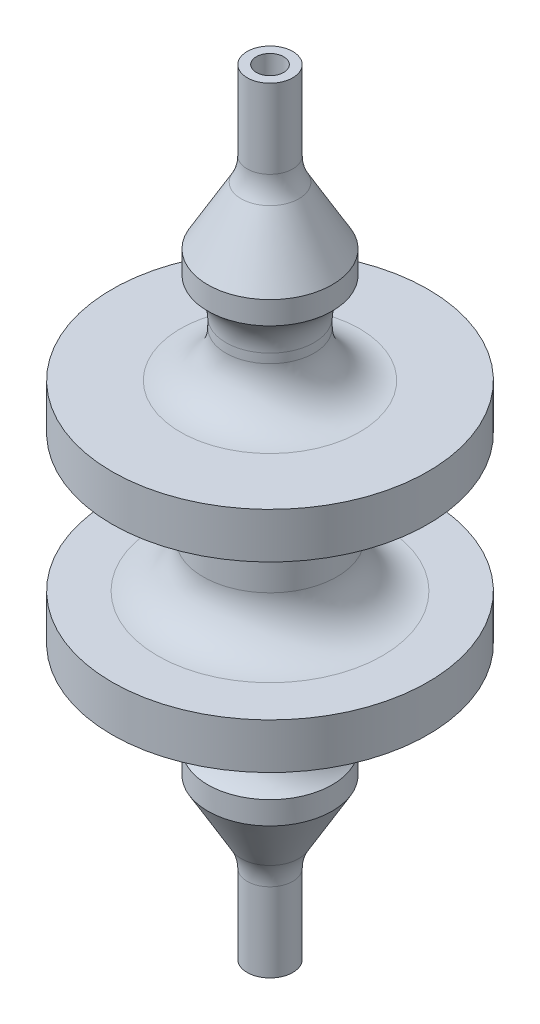
ISO-10303-21;
HEADER;
FILE_DESCRIPTION(('STEP AP214'),'2;1');
FILE_NAME('part.step','',(''),(''),'','','');
FILE_SCHEMA(('AUTOMOTIVE_DESIGN { 1 0 10303 214 1 1 1 1 }'));
ENDSEC;
DATA;
#1=APPLICATION_CONTEXT('core data for automotive mechanical design processes');
#2=APPLICATION_PROTOCOL_DEFINITION('international standard','automotive_design',2000,#1);
#3=PRODUCT_CONTEXT('',#1,'mechanical');
#4=PRODUCT('Part','Part','',(#3));
#5=PRODUCT_RELATED_PRODUCT_CATEGORY('part','',(#4));
#6=PRODUCT_DEFINITION_FORMATION('','',#4);
#7=PRODUCT_DEFINITION_CONTEXT('part definition',#1,'design');
#8=PRODUCT_DEFINITION('design','',#6,#7);
#9=PRODUCT_DEFINITION_SHAPE('','',#8);
#10=(LENGTH_UNIT() NAMED_UNIT(*) SI_UNIT(.MILLI.,.METRE.));
#11=(NAMED_UNIT(*) PLANE_ANGLE_UNIT() SI_UNIT($,.RADIAN.));
#12=(NAMED_UNIT(*) SI_UNIT($,.STERADIAN.) SOLID_ANGLE_UNIT());
#13=UNCERTAINTY_MEASURE_WITH_UNIT(LENGTH_MEASURE(1.E-05),#10,'distance_accuracy_value','');
#14=(GEOMETRIC_REPRESENTATION_CONTEXT(3) GLOBAL_UNCERTAINTY_ASSIGNED_CONTEXT((#13)) GLOBAL_UNIT_ASSIGNED_CONTEXT((#10,
#11,#12)) REPRESENTATION_CONTEXT('',''));
#15=CARTESIAN_POINT('',(0.,0.,0.));
#16=DIRECTION('',(0.,0.,1.));
#17=DIRECTION('',(1.,0.,0.));
#18=AXIS2_PLACEMENT_3D('',#15,#16,#17);
#19=CARTESIAN_POINT('',(-3.38399224030296,-8.66807827173179,0.));
#20=DIRECTION('',(0.,-1.,0.));
#21=DIRECTION('',(0.,0.,-1.));
#22=AXIS2_PLACEMENT_3D('',#19,#20,#21);
#23=PLANE('',#22);
#24=CARTESIAN_POINT('',(0.0820331634814877,-8.66807827173179,0.));
#25=DIRECTION('',(0.,-1.,0.));
#26=DIRECTION('',(0.,0.,-1.));
#27=AXIS2_PLACEMENT_3D('',#24,#25,#26);
#28=CIRCLE('',#27,2.46602540378444);
#29=CARTESIAN_POINT('',(0.0820331634814877,-8.66807827173179,-2.46602540378444));
#30=VERTEX_POINT('',#29);
#31=EDGE_CURVE('E69',#30,#30,#28,.T.);
#32=ORIENTED_EDGE('',*,*,#31,.T.);
#33=EDGE_LOOP('',(#32));
#34=FACE_BOUND('',#33,.T.);
#35=CARTESIAN_POINT('',(0.0820331634814877,-8.66807827173179,0.));
#36=DIRECTION('',(0.,-1.,0.));
#37=DIRECTION('',(0.,0.,-1.));
#38=AXIS2_PLACEMENT_3D('',#35,#36,#37);
#39=CIRCLE('',#38,3.46602540378444);
#40=CARTESIAN_POINT('',(0.0820331634814877,-8.66807827173179,-3.46602540378444));
#41=VERTEX_POINT('',#40);
#42=EDGE_CURVE('E137',#41,#41,#39,.T.);
#43=ORIENTED_EDGE('',*,*,#42,.F.);
#44=EDGE_LOOP('',(#43));
#45=FACE_BOUND('',#44,.T.);
#46=ADVANCED_FACE('F37',(#34,#45),#23,.F.);
#47=CARTESIAN_POINT('',(0.0820331634814877,-29.4659298647687,0.));
#48=DIRECTION('',(0.,-1.,0.));
#49=DIRECTION('',(0.,0.,-1.));
#50=AXIS2_PLACEMENT_3D('',#47,#48,#49);
#51=CYLINDRICAL_SURFACE('',#50,1.46602540378444);
#52=CARTESIAN_POINT('',(0.0820331634814877,-7.66807827173179,0.));
#53=DIRECTION('',(0.,-1.,0.));
#54=DIRECTION('',(0.,0.,-1.));
#55=AXIS2_PLACEMENT_3D('',#52,#53,#54);
#56=CIRCLE('',#55,1.46602540378444);
#57=CARTESIAN_POINT('',(0.0820331634814877,-7.66807827173179,-1.46602540378444));
#58=VERTEX_POINT('',#57);
#59=EDGE_CURVE('E61',#58,#58,#56,.F.);
#60=ORIENTED_EDGE('',*,*,#59,.T.);
#61=EDGE_LOOP('',(#60));
#62=FACE_BOUND('',#61,.T.);
#63=CARTESIAN_POINT('',(0.0820331634814877,-6.66807827173179,0.));
#64=DIRECTION('',(0.,1.,0.));
#65=DIRECTION('',(0.,0.,1.));
#66=AXIS2_PLACEMENT_3D('',#63,#64,#65);
#67=CIRCLE('',#66,1.46602540378444);
#68=CARTESIAN_POINT('',(0.0820331634814877,-6.66807827173179,1.46602540378444));
#69=VERTEX_POINT('',#68);
#70=EDGE_CURVE('E65',#69,#69,#67,.F.);
#71=ORIENTED_EDGE('',*,*,#70,.T.);
#72=EDGE_LOOP('',(#71));
#73=FACE_BOUND('',#72,.T.);
#74=ADVANCED_FACE('F163',(#62,#73),#51,.T.);
#75=CARTESIAN_POINT('',(-3.38399224030296,-5.66807827173179,0.));
#76=DIRECTION('',(0.,1.,0.));
#77=DIRECTION('',(0.,0.,1.));
#78=AXIS2_PLACEMENT_3D('',#75,#76,#77);
#79=PLANE('',#78);
#80=CARTESIAN_POINT('',(0.0820331634814877,-5.66807827173179,0.));
#81=DIRECTION('',(0.,1.,0.));
#82=DIRECTION('',(0.,0.,1.));
#83=AXIS2_PLACEMENT_3D('',#80,#81,#82);
#84=CIRCLE('',#83,2.46602540378444);
#85=CARTESIAN_POINT('',(0.0820331634814877,-5.66807827173179,2.46602540378444));
#86=VERTEX_POINT('',#85);
#87=EDGE_CURVE('E57',#86,#86,#84,.T.);
#88=ORIENTED_EDGE('',*,*,#87,.T.);
#89=EDGE_LOOP('',(#88));
#90=FACE_BOUND('',#89,.T.);
#91=CARTESIAN_POINT('',(0.0820331634814877,-5.66807827173179,0.));
#92=DIRECTION('',(0.,-1.,0.));
#93=DIRECTION('',(0.,0.,-1.));
#94=AXIS2_PLACEMENT_3D('',#91,#92,#93);
#95=CIRCLE('',#94,3.46602540378444);
#96=CARTESIAN_POINT('',(0.0820331634814877,-5.66807827173179,-3.46602540378444));
#97=VERTEX_POINT('',#96);
#98=EDGE_CURVE('E101',#97,#97,#95,.T.);
#99=ORIENTED_EDGE('',*,*,#98,.T.);
#100=EDGE_LOOP('',(#99));
#101=FACE_BOUND('',#100,.T.);
#102=ADVANCED_FACE('F169',(#90,#101),#79,.F.);
#103=CARTESIAN_POINT('',(0.0820331634814877,-29.4659298647687,0.));
#104=DIRECTION('',(0.,-1.,0.));
#105=DIRECTION('',(0.,0.,-1.));
#106=AXIS2_PLACEMENT_3D('',#103,#104,#105);
#107=CYLINDRICAL_SURFACE('',#106,3.46602540378444);
#108=ORIENTED_EDGE('',*,*,#98,.F.);
#109=EDGE_LOOP('',(#108));
#110=FACE_BOUND('',#109,.T.);
#111=CARTESIAN_POINT('',(0.0820331634814877,-4.66807827173179,0.));
#112=DIRECTION('',(0.,-1.,0.));
#113=DIRECTION('',(0.,0.,-1.));
#114=AXIS2_PLACEMENT_3D('',#111,#112,#113);
#115=CIRCLE('',#114,3.46602540378444);
#116=CARTESIAN_POINT('',(0.0820331634814877,-4.66807827173179,-3.46602540378444));
#117=VERTEX_POINT('',#116);
#118=EDGE_CURVE('E105',#117,#117,#115,.T.);
#119=ORIENTED_EDGE('',*,*,#118,.T.);
#120=EDGE_LOOP('',(#119));
#121=FACE_BOUND('',#120,.T.);
#122=ADVANCED_FACE('F210',(#110,#121),#107,.T.);
#123=CARTESIAN_POINT('',(-0.883992240302957,-4.66807827173179,0.));
#124=DIRECTION('',(0.,-1.,0.));
#125=DIRECTION('',(0.,0.,-1.));
#126=AXIS2_PLACEMENT_3D('',#123,#124,#125);
#127=PLANE('',#126);
#128=CARTESIAN_POINT('',(0.0820331634814877,-4.66807827173179,0.));
#129=DIRECTION('',(0.,-1.,0.));
#130=DIRECTION('',(0.,0.,-1.));
#131=AXIS2_PLACEMENT_3D('',#128,#129,#130);
#132=CIRCLE('',#131,1.96602540378444);
#133=CARTESIAN_POINT('',(0.0820331634814877,-4.66807827173179,-1.96602540378444));
#134=VERTEX_POINT('',#133);
#135=EDGE_CURVE('E51',#134,#134,#132,.T.);
#136=ORIENTED_EDGE('',*,*,#135,.T.);
#137=EDGE_LOOP('',(#136));
#138=FACE_BOUND('',#137,.T.);
#139=ORIENTED_EDGE('',*,*,#118,.F.);
#140=EDGE_LOOP('',(#139));
#141=FACE_BOUND('',#140,.T.);
#142=ADVANCED_FACE('F206',(#138,#141),#127,.F.);
#143=CARTESIAN_POINT('',(0.0820331634814877,-29.4659298647687,0.));
#144=DIRECTION('',(0.,-1.,0.));
#145=DIRECTION('',(0.,0.,-1.));
#146=AXIS2_PLACEMENT_3D('',#143,#144,#145);
#147=CYLINDRICAL_SURFACE('',#146,0.966025403784444);
#148=CARTESIAN_POINT('',(0.0820331634814877,-3.66807827173179,0.));
#149=DIRECTION('',(0.,-1.,0.));
#150=DIRECTION('',(0.,0.,-1.));
#151=AXIS2_PLACEMENT_3D('',#148,#149,#150);
#152=CIRCLE('',#151,0.966025403784444);
#153=CARTESIAN_POINT('',(0.0820331634814877,-3.66807827173179,-0.966025403784444));
#154=VERTEX_POINT('',#153);
#155=EDGE_CURVE('E10',#154,#154,#152,.F.);
#156=ORIENTED_EDGE('',*,*,#155,.T.);
#157=EDGE_LOOP('',(#156));
#158=FACE_BOUND('',#157,.T.);
#159=CARTESIAN_POINT('',(0.0820331634814877,-3.46807827173179,0.));
#160=DIRECTION('',(0.,1.,0.));
#161=DIRECTION('',(0.,0.,1.));
#162=AXIS2_PLACEMENT_3D('',#159,#160,#161);
#163=CIRCLE('',#162,0.966025403784444);
#164=CARTESIAN_POINT('',(0.0820331634814877,-3.46807827173179,0.966025403784444));
#165=VERTEX_POINT('',#164);
#166=EDGE_CURVE('E46',#165,#165,#163,.F.);
#167=ORIENTED_EDGE('',*,*,#166,.T.);
#168=EDGE_LOOP('',(#167));
#169=FACE_BOUND('',#168,.T.);
#170=ADVANCED_FACE('F209',(#158,#169),#147,.T.);
#171=CARTESIAN_POINT('',(0.0820331634814877,-29.4659298647687,0.));
#172=DIRECTION('',(0.,-1.,0.));
#173=DIRECTION('',(0.,0.,-1.));
#174=AXIS2_PLACEMENT_3D('',#171,#172,#173);
#175=CYLINDRICAL_SURFACE('',#174,1.36602540378444);
#176=CARTESIAN_POINT('',(0.0820331634814877,-2.66807827173179,0.));
#177=DIRECTION('',(0.,-1.,0.));
#178=DIRECTION('',(0.,0.,-1.));
#179=AXIS2_PLACEMENT_3D('',#176,#177,#178);
#180=CIRCLE('',#179,1.36602540378444);
#181=CARTESIAN_POINT('',(0.0820331634814877,-2.66807827173179,-1.36602540378444));
#182=VERTEX_POINT('',#181);
#183=EDGE_CURVE('E109',#182,#182,#180,.T.);
#184=ORIENTED_EDGE('',*,*,#183,.F.);
#185=EDGE_LOOP('',(#184));
#186=FACE_BOUND('',#185,.T.);
#187=CARTESIAN_POINT('',(0.0820331634814877,-2.16807827173179,0.));
#188=DIRECTION('',(0.,-1.,0.));
#189=DIRECTION('',(0.,0.,-1.));
#190=AXIS2_PLACEMENT_3D('',#187,#188,#189);
#191=CIRCLE('',#190,1.36602540378444);
#192=CARTESIAN_POINT('',(0.0820331634814877,-2.16807827173179,-1.36602540378444));
#193=VERTEX_POINT('',#192);
#194=EDGE_CURVE('E113',#193,#193,#191,.T.);
#195=ORIENTED_EDGE('',*,*,#194,.T.);
#196=EDGE_LOOP('',(#195));
#197=FACE_BOUND('',#196,.T.);
#198=ADVANCED_FACE('F225',(#186,#197),#175,.T.);
#199=CARTESIAN_POINT('',(0.0820331634814877,-0.668078271731789,0.));
#200=DIRECTION('',(0.,-1.,0.));
#201=DIRECTION('',(0.,0.,-1.));
#202=AXIS2_PLACEMENT_3D('',#199,#200,#201);
#203=CONICAL_SURFACE('',#202,0.500000000000003,0.523598775598301);
#204=CARTESIAN_POINT('',(0.0820331634814877,-0.900129079300667,0.));
#205=DIRECTION('',(0.,-1.,0.));
#206=DIRECTION('',(0.,0.,-1.));
#207=AXIS2_PLACEMENT_3D('',#204,#205,#206);
#208=CIRCLE('',#207,0.633974596215566);
#209=CARTESIAN_POINT('',(0.0820331634814877,-0.900129079300667,-0.633974596215566));
#210=VERTEX_POINT('',#209);
#211=EDGE_CURVE('E81',#210,#210,#208,.T.);
#212=ORIENTED_EDGE('',*,*,#211,.T.);
#213=EDGE_LOOP('',(#212));
#214=FACE_BOUND('',#213,.T.);
#215=ORIENTED_EDGE('',*,*,#194,.F.);
#216=EDGE_LOOP('',(#215));
#217=FACE_BOUND('',#216,.T.);
#218=ADVANCED_FACE('F228',(#214,#217),#203,.T.);
#219=CARTESIAN_POINT('',(0.0820331634814877,-29.4659298647687,0.));
#220=DIRECTION('',(0.,-1.,0.));
#221=DIRECTION('',(0.,0.,-1.));
#222=AXIS2_PLACEMENT_3D('',#219,#220,#221);
#223=CYLINDRICAL_SURFACE('',#222,0.500000000000004);
#224=CARTESIAN_POINT('',(0.0820331634814877,-0.400129079300666,0.));
#225=DIRECTION('',(0.,-1.,0.));
#226=DIRECTION('',(0.,0.,-1.));
#227=AXIS2_PLACEMENT_3D('',#224,#225,#226);
#228=CIRCLE('',#227,0.500000000000004);
#229=CARTESIAN_POINT('',(0.0820331634814877,-0.400129079300666,-0.500000000000004));
#230=VERTEX_POINT('',#229);
#231=EDGE_CURVE('E77',#230,#230,#228,.F.);
#232=ORIENTED_EDGE('',*,*,#231,.T.);
#233=EDGE_LOOP('',(#232));
#234=FACE_BOUND('',#233,.T.);
#235=CARTESIAN_POINT('',(0.0820331634814877,1.33192172826821,0.));
#236=DIRECTION('',(0.,-1.,0.));
#237=DIRECTION('',(0.,0.,-1.));
#238=AXIS2_PLACEMENT_3D('',#235,#236,#237);
#239=CIRCLE('',#238,0.500000000000004);
#240=CARTESIAN_POINT('',(0.0820331634814877,1.33192172826821,-0.500000000000004));
#241=VERTEX_POINT('',#240);
#242=EDGE_CURVE('E117',#241,#241,#239,.T.);
#243=ORIENTED_EDGE('',*,*,#242,.T.);
#244=EDGE_LOOP('',(#243));
#245=FACE_BOUND('',#244,.T.);
#246=ADVANCED_FACE('F232',(#234,#245),#223,.T.);
#247=CARTESIAN_POINT('',(0.0820331634814839,1.33192172826821,0.));
#248=DIRECTION('',(0.,-1.,0.));
#249=DIRECTION('',(0.,0.,-1.));
#250=AXIS2_PLACEMENT_3D('',#247,#248,#249);
#251=PLANE('',#250);
#252=CARTESIAN_POINT('',(0.0820331634814877,1.33192172826821,0.));
#253=DIRECTION('',(0.,1.,0.));
#254=DIRECTION('',(0.,0.,1.));
#255=AXIS2_PLACEMENT_3D('',#252,#253,#254);
#256=CIRCLE('',#255,0.3);
#257=CARTESIAN_POINT('',(0.0820331634814877,1.33192172826821,0.3));
#258=VERTEX_POINT('',#257);
#259=EDGE_CURVE('E141',#258,#258,#256,.T.);
#260=ORIENTED_EDGE('',*,*,#259,.F.);
#261=EDGE_LOOP('',(#260));
#262=FACE_BOUND('',#261,.T.);
#263=ORIENTED_EDGE('',*,*,#242,.F.);
#264=EDGE_LOOP('',(#263));
#265=FACE_BOUND('',#264,.T.);
#266=ADVANCED_FACE('F236',(#262,#265),#251,.F.);
#267=CARTESIAN_POINT('',(0.0820331634814839,-15.6680782717318,0.));
#268=DIRECTION('',(0.,1.,0.));
#269=DIRECTION('',(0.,0.,1.));
#270=AXIS2_PLACEMENT_3D('',#267,#268,#269);
#271=PLANE('',#270);
#272=CARTESIAN_POINT('',(0.0820331634814877,-15.6680782717318,0.));
#273=DIRECTION('',(0.,1.,0.));
#274=DIRECTION('',(0.,0.,1.));
#275=AXIS2_PLACEMENT_3D('',#272,#273,#274);
#276=CIRCLE('',#275,0.3);
#277=CARTESIAN_POINT('',(0.0820331634814877,-15.6680782717318,0.3));
#278=VERTEX_POINT('',#277);
#279=EDGE_CURVE('E41',#278,#278,#276,.T.);
#280=ORIENTED_EDGE('',*,*,#279,.T.);
#281=EDGE_LOOP('',(#280));
#282=FACE_BOUND('',#281,.T.);
#283=CARTESIAN_POINT('',(0.0820331634814877,-15.6680782717318,0.));
#284=DIRECTION('',(0.,-1.,0.));
#285=DIRECTION('',(0.,0.,-1.));
#286=AXIS2_PLACEMENT_3D('',#283,#284,#285);
#287=CIRCLE('',#286,0.500000000000004);
#288=CARTESIAN_POINT('',(0.0820331634814877,-15.6680782717318,-0.500000000000004));
#289=VERTEX_POINT('',#288);
#290=EDGE_CURVE('E121',#289,#289,#287,.T.);
#291=ORIENTED_EDGE('',*,*,#290,.T.);
#292=EDGE_LOOP('',(#291));
#293=FACE_BOUND('',#292,.T.);
#294=ADVANCED_FACE('F150',(#282,#293),#271,.F.);
#295=CARTESIAN_POINT('',(0.0820331634814877,-29.4659298647687,0.));
#296=DIRECTION('',(0.,-1.,0.));
#297=DIRECTION('',(0.,0.,-1.));
#298=AXIS2_PLACEMENT_3D('',#295,#296,#297);
#299=CYLINDRICAL_SURFACE('',#298,0.500000000000004);
#300=CARTESIAN_POINT('',(0.0820331634814877,-13.9360274641629,0.));
#301=DIRECTION('',(0.,-1.,0.));
#302=DIRECTION('',(0.,0.,-1.));
#303=AXIS2_PLACEMENT_3D('',#300,#301,#302);
#304=CIRCLE('',#303,0.500000000000004);
#305=CARTESIAN_POINT('',(0.0820331634814877,-13.9360274641629,-0.500000000000004));
#306=VERTEX_POINT('',#305);
#307=EDGE_CURVE('E89',#306,#306,#304,.T.);
#308=ORIENTED_EDGE('',*,*,#307,.T.);
#309=EDGE_LOOP('',(#308));
#310=FACE_BOUND('',#309,.T.);
#311=ORIENTED_EDGE('',*,*,#290,.F.);
#312=EDGE_LOOP('',(#311));
#313=FACE_BOUND('',#312,.T.);
#314=ADVANCED_FACE('F243',(#310,#313),#299,.T.);
#315=CARTESIAN_POINT('',(0.0820331634814877,-12.1680782717318,0.));
#316=DIRECTION('',(0.,1.,0.));
#317=DIRECTION('',(0.,0.,1.));
#318=AXIS2_PLACEMENT_3D('',#315,#316,#317);
#319=CONICAL_SURFACE('',#318,1.36602540378444,0.523598775598301);
#320=CARTESIAN_POINT('',(0.0820331634814877,-13.4360274641629,0.));
#321=DIRECTION('',(0.,1.,0.));
#322=DIRECTION('',(0.,0.,1.));
#323=AXIS2_PLACEMENT_3D('',#320,#321,#322);
#324=CIRCLE('',#323,0.633974596215565);
#325=CARTESIAN_POINT('',(0.0820331634814877,-13.4360274641629,0.633974596215565));
#326=VERTEX_POINT('',#325);
#327=EDGE_CURVE('E85',#326,#326,#324,.T.);
#328=ORIENTED_EDGE('',*,*,#327,.T.);
#329=EDGE_LOOP('',(#328));
#330=FACE_BOUND('',#329,.T.);
#331=CARTESIAN_POINT('',(0.0820331634814877,-12.1680782717318,0.));
#332=DIRECTION('',(0.,-1.,0.));
#333=DIRECTION('',(0.,0.,-1.));
#334=AXIS2_PLACEMENT_3D('',#331,#332,#333);
#335=CIRCLE('',#334,1.36602540378444);
#336=CARTESIAN_POINT('',(0.0820331634814877,-12.1680782717318,-1.36602540378444));
#337=VERTEX_POINT('',#336);
#338=EDGE_CURVE('E125',#337,#337,#335,.T.);
#339=ORIENTED_EDGE('',*,*,#338,.T.);
#340=EDGE_LOOP('',(#339));
#341=FACE_BOUND('',#340,.T.);
#342=ADVANCED_FACE('F246',(#330,#341),#319,.T.);
#343=CARTESIAN_POINT('',(0.0820331634814877,-29.4659298647687,0.));
#344=DIRECTION('',(0.,-1.,0.));
#345=DIRECTION('',(0.,0.,-1.));
#346=AXIS2_PLACEMENT_3D('',#343,#344,#345);
#347=CYLINDRICAL_SURFACE('',#346,1.36602540378444);
#348=ORIENTED_EDGE('',*,*,#338,.F.);
#349=EDGE_LOOP('',(#348));
#350=FACE_BOUND('',#349,.T.);
#351=CARTESIAN_POINT('',(0.0820331634814877,-11.6680782717318,0.));
#352=DIRECTION('',(0.,-1.,0.));
#353=DIRECTION('',(0.,0.,-1.));
#354=AXIS2_PLACEMENT_3D('',#351,#352,#353);
#355=CIRCLE('',#354,1.36602540378444);
#356=CARTESIAN_POINT('',(0.0820331634814877,-11.6680782717318,-1.36602540378444));
#357=VERTEX_POINT('',#356);
#358=EDGE_CURVE('E129',#357,#357,#355,.T.);
#359=ORIENTED_EDGE('',*,*,#358,.T.);
#360=EDGE_LOOP('',(#359));
#361=FACE_BOUND('',#360,.T.);
#362=ADVANCED_FACE('F250',(#350,#361),#347,.T.);
#363=CARTESIAN_POINT('',(0.0820331634814877,-29.4659298647687,0.));
#364=DIRECTION('',(0.,-1.,0.));
#365=DIRECTION('',(0.,0.,-1.));
#366=AXIS2_PLACEMENT_3D('',#363,#364,#365);
#367=CYLINDRICAL_SURFACE('',#366,0.966025403784444);
#368=CARTESIAN_POINT('',(0.0820331634814877,-10.8680782717318,0.));
#369=DIRECTION('',(0.,-1.,0.));
#370=DIRECTION('',(0.,0.,-1.));
#371=AXIS2_PLACEMENT_3D('',#368,#369,#370);
#372=CIRCLE('',#371,0.966025403784444);
#373=CARTESIAN_POINT('',(0.0820331634814877,-10.8680782717318,-0.966025403784444));
#374=VERTEX_POINT('',#373);
#375=EDGE_CURVE('E93',#374,#374,#372,.F.);
#376=ORIENTED_EDGE('',*,*,#375,.T.);
#377=EDGE_LOOP('',(#376));
#378=FACE_BOUND('',#377,.T.);
#379=CARTESIAN_POINT('',(0.0820331634814877,-10.6680782717318,0.));
#380=DIRECTION('',(0.,1.,0.));
#381=DIRECTION('',(0.,0.,1.));
#382=AXIS2_PLACEMENT_3D('',#379,#380,#381);
#383=CIRCLE('',#382,0.966025403784444);
#384=CARTESIAN_POINT('',(0.0820331634814877,-10.6680782717318,0.966025403784444));
#385=VERTEX_POINT('',#384);
#386=EDGE_CURVE('E97',#385,#385,#383,.F.);
#387=ORIENTED_EDGE('',*,*,#386,.T.);
#388=EDGE_LOOP('',(#387));
#389=FACE_BOUND('',#388,.T.);
#390=ADVANCED_FACE('F254',(#378,#389),#367,.T.);
#391=CARTESIAN_POINT('',(-0.883992240302957,-9.66807827173179,0.));
#392=DIRECTION('',(0.,1.,0.));
#393=DIRECTION('',(0.,0.,1.));
#394=AXIS2_PLACEMENT_3D('',#391,#392,#393);
#395=PLANE('',#394);
#396=CARTESIAN_POINT('',(0.0820331634814877,-9.66807827173179,0.));
#397=DIRECTION('',(0.,1.,0.));
#398=DIRECTION('',(0.,0.,1.));
#399=AXIS2_PLACEMENT_3D('',#396,#397,#398);
#400=CIRCLE('',#399,1.96602540378444);
#401=CARTESIAN_POINT('',(0.0820331634814877,-9.66807827173179,1.96602540378444));
#402=VERTEX_POINT('',#401);
#403=EDGE_CURVE('E73',#402,#402,#400,.T.);
#404=ORIENTED_EDGE('',*,*,#403,.T.);
#405=EDGE_LOOP('',(#404));
#406=FACE_BOUND('',#405,.T.);
#407=CARTESIAN_POINT('',(0.0820331634814877,-9.66807827173179,0.));
#408=DIRECTION('',(0.,-1.,0.));
#409=DIRECTION('',(0.,0.,-1.));
#410=AXIS2_PLACEMENT_3D('',#407,#408,#409);
#411=CIRCLE('',#410,3.46602540378444);
#412=CARTESIAN_POINT('',(0.0820331634814877,-9.66807827173179,-3.46602540378444));
#413=VERTEX_POINT('',#412);
#414=EDGE_CURVE('E133',#413,#413,#411,.T.);
#415=ORIENTED_EDGE('',*,*,#414,.T.);
#416=EDGE_LOOP('',(#415));
#417=FACE_BOUND('',#416,.T.);
#418=ADVANCED_FACE('F258',(#406,#417),#395,.F.);
#419=CARTESIAN_POINT('',(0.0820331634814877,-29.4659298647687,0.));
#420=DIRECTION('',(0.,-1.,0.));
#421=DIRECTION('',(0.,0.,-1.));
#422=AXIS2_PLACEMENT_3D('',#419,#420,#421);
#423=CYLINDRICAL_SURFACE('',#422,3.46602540378444);
#424=ORIENTED_EDGE('',*,*,#414,.F.);
#425=EDGE_LOOP('',(#424));
#426=FACE_BOUND('',#425,.T.);
#427=ORIENTED_EDGE('',*,*,#42,.T.);
#428=EDGE_LOOP('',(#427));
#429=FACE_BOUND('',#428,.T.);
#430=ADVANCED_FACE('F179',(#426,#429),#423,.T.);
#431=CARTESIAN_POINT('',(0.0820331634814877,-10.8680782717318,0.));
#432=DIRECTION('',(0.,-1.,0.));
#433=DIRECTION('',(0.,0.,-1.));
#434=AXIS2_PLACEMENT_3D('',#431,#432,#433);
#435=TOROIDAL_SURFACE('',#434,1.96602540378444,1.);
#436=ORIENTED_EDGE('',*,*,#375,.F.);
#437=EDGE_LOOP('',(#436));
#438=FACE_BOUND('',#437,.T.);
#439=ORIENTED_EDGE('',*,*,#358,.F.);
#440=EDGE_LOOP('',(#439));
#441=FACE_BOUND('',#440,.T.);
#442=ADVANCED_FACE('F175',(#438,#441),#435,.F.);
#443=CARTESIAN_POINT('',(0.0820331634814877,-13.9360274641629,0.));
#444=DIRECTION('',(0.,-1.,0.));
#445=DIRECTION('',(0.,0.,-1.));
#446=AXIS2_PLACEMENT_3D('',#443,#444,#445);
#447=TOROIDAL_SURFACE('',#446,1.5,1.);
#448=ORIENTED_EDGE('',*,*,#327,.F.);
#449=EDGE_LOOP('',(#448));
#450=FACE_BOUND('',#449,.T.);
#451=ORIENTED_EDGE('',*,*,#307,.F.);
#452=EDGE_LOOP('',(#451));
#453=FACE_BOUND('',#452,.T.);
#454=ADVANCED_FACE('F178',(#450,#453),#447,.F.);
#455=CARTESIAN_POINT('',(0.0820331634814877,-0.400129079300666,0.));
#456=DIRECTION('',(0.,-1.,0.));
#457=DIRECTION('',(0.,0.,-1.));
#458=AXIS2_PLACEMENT_3D('',#455,#456,#457);
#459=TOROIDAL_SURFACE('',#458,1.5,1.);
#460=ORIENTED_EDGE('',*,*,#231,.F.);
#461=EDGE_LOOP('',(#460));
#462=FACE_BOUND('',#461,.T.);
#463=ORIENTED_EDGE('',*,*,#211,.F.);
#464=EDGE_LOOP('',(#463));
#465=FACE_BOUND('',#464,.T.);
#466=ADVANCED_FACE('F183',(#462,#465),#459,.F.);
#467=CARTESIAN_POINT('',(0.0820331634814877,-10.6680782717318,0.));
#468=DIRECTION('',(0.,1.,0.));
#469=DIRECTION('',(0.,0.,1.));
#470=AXIS2_PLACEMENT_3D('',#467,#468,#469);
#471=TOROIDAL_SURFACE('',#470,1.96602540378444,1.);
#472=ORIENTED_EDGE('',*,*,#403,.F.);
#473=EDGE_LOOP('',(#472));
#474=FACE_BOUND('',#473,.T.);
#475=ORIENTED_EDGE('',*,*,#386,.F.);
#476=EDGE_LOOP('',(#475));
#477=FACE_BOUND('',#476,.T.);
#478=ADVANCED_FACE('F187',(#474,#477),#471,.F.);
#479=CARTESIAN_POINT('',(0.0820331634814877,-7.66807827173179,0.));
#480=DIRECTION('',(0.,-1.,0.));
#481=DIRECTION('',(0.,0.,-1.));
#482=AXIS2_PLACEMENT_3D('',#479,#480,#481);
#483=TOROIDAL_SURFACE('',#482,2.46602540378444,1.);
#484=ORIENTED_EDGE('',*,*,#59,.F.);
#485=EDGE_LOOP('',(#484));
#486=FACE_BOUND('',#485,.T.);
#487=ORIENTED_EDGE('',*,*,#31,.F.);
#488=EDGE_LOOP('',(#487));
#489=FACE_BOUND('',#488,.T.);
#490=ADVANCED_FACE('F191',(#486,#489),#483,.F.);
#491=CARTESIAN_POINT('',(0.0820331634814877,-6.66807827173179,0.));
#492=DIRECTION('',(0.,1.,0.));
#493=DIRECTION('',(0.,0.,1.));
#494=AXIS2_PLACEMENT_3D('',#491,#492,#493);
#495=TOROIDAL_SURFACE('',#494,2.46602540378444,1.);
#496=ORIENTED_EDGE('',*,*,#87,.F.);
#497=EDGE_LOOP('',(#496));
#498=FACE_BOUND('',#497,.T.);
#499=ORIENTED_EDGE('',*,*,#70,.F.);
#500=EDGE_LOOP('',(#499));
#501=FACE_BOUND('',#500,.T.);
#502=ADVANCED_FACE('F195',(#498,#501),#495,.F.);
#503=CARTESIAN_POINT('',(0.0820331634814877,-3.66807827173179,0.));
#504=DIRECTION('',(0.,-1.,0.));
#505=DIRECTION('',(0.,0.,-1.));
#506=AXIS2_PLACEMENT_3D('',#503,#504,#505);
#507=TOROIDAL_SURFACE('',#506,1.96602540378444,1.);
#508=ORIENTED_EDGE('',*,*,#155,.F.);
#509=EDGE_LOOP('',(#508));
#510=FACE_BOUND('',#509,.T.);
#511=ORIENTED_EDGE('',*,*,#135,.F.);
#512=EDGE_LOOP('',(#511));
#513=FACE_BOUND('',#512,.T.);
#514=ADVANCED_FACE('F159',(#510,#513),#507,.F.);
#515=CARTESIAN_POINT('',(0.0820331634814877,-3.46807827173179,0.));
#516=DIRECTION('',(0.,1.,0.));
#517=DIRECTION('',(0.,0.,1.));
#518=AXIS2_PLACEMENT_3D('',#515,#516,#517);
#519=TOROIDAL_SURFACE('',#518,1.96602540378444,1.);
#520=ORIENTED_EDGE('',*,*,#183,.T.);
#521=EDGE_LOOP('',(#520));
#522=FACE_BOUND('',#521,.T.);
#523=ORIENTED_EDGE('',*,*,#166,.F.);
#524=EDGE_LOOP('',(#523));
#525=FACE_BOUND('',#524,.T.);
#526=ADVANCED_FACE('F39',(#522,#525),#519,.F.);
#527=CARTESIAN_POINT('',(0.0820331634814877,-28.6680782717318,0.));
#528=DIRECTION('',(0.,1.,0.));
#529=DIRECTION('',(0.,0.,1.));
#530=AXIS2_PLACEMENT_3D('',#527,#528,#529);
#531=CYLINDRICAL_SURFACE('',#530,0.3);
#532=ORIENTED_EDGE('',*,*,#259,.T.);
#533=EDGE_LOOP('',(#532));
#534=FACE_BOUND('',#533,.T.);
#535=ORIENTED_EDGE('',*,*,#279,.F.);
#536=EDGE_LOOP('',(#535));
#537=FACE_BOUND('',#536,.T.);
#538=ADVANCED_FACE('F153',(#534,#537),#531,.F.);
#539=CLOSED_SHELL('',(#46,#74,#102,#122,#142,#170,#198,#218,#246,#266,#294,#314,#342,#362,#390,
#418,#430,#442,#454,#466,#478,#490,#502,#514,#526,#538));
#540=MANIFOLD_SOLID_BREP('B2',#539);
#541=ADVANCED_BREP_SHAPE_REPRESENTATION('',(#18,#540),#14);
#542=SHAPE_DEFINITION_REPRESENTATION(#9,#541);
ENDSEC;
END-ISO-10303-21;
